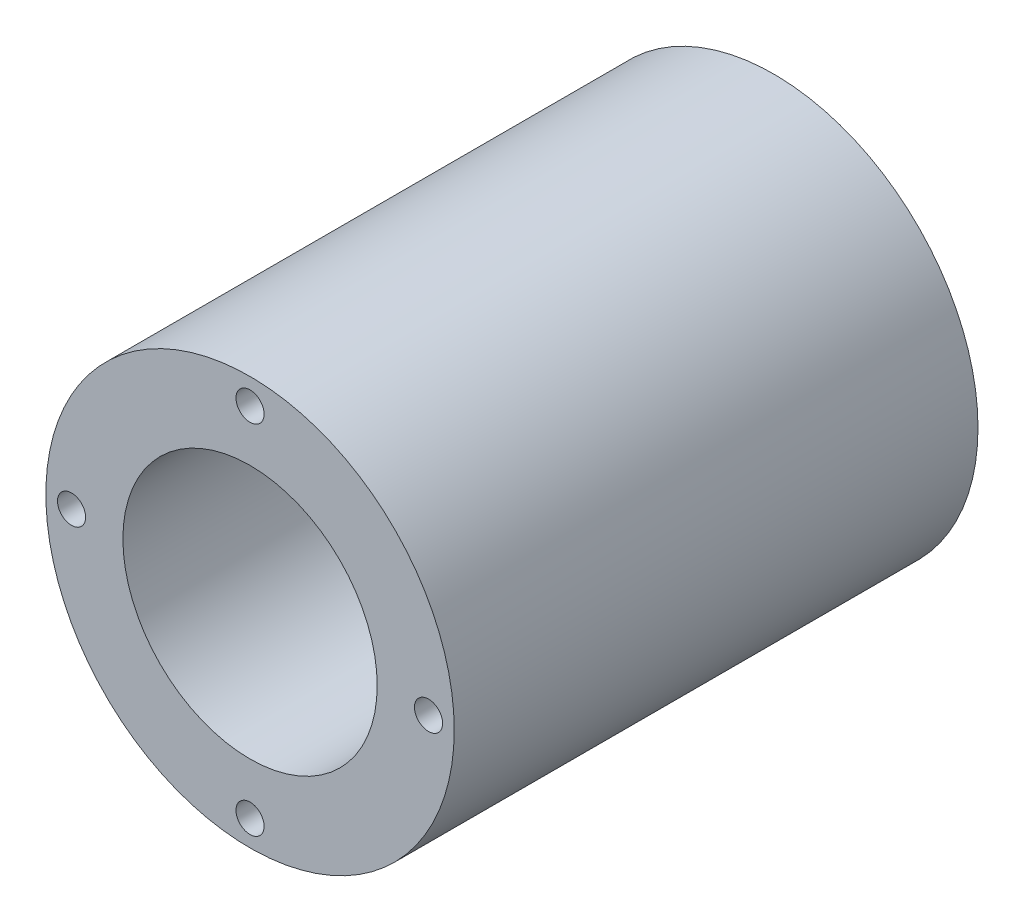
ISO-10303-21;
HEADER;
FILE_DESCRIPTION(('STEP AP214'),'2;1');
FILE_NAME('part.step','',(''),(''),'','','');
FILE_SCHEMA(('AUTOMOTIVE_DESIGN { 1 0 10303 214 1 1 1 1 }'));
ENDSEC;
DATA;
#1=APPLICATION_CONTEXT('core data for automotive mechanical design processes');
#2=APPLICATION_PROTOCOL_DEFINITION('international standard','automotive_design',2000,#1);
#3=PRODUCT_CONTEXT('',#1,'mechanical');
#4=PRODUCT('Part','Part','',(#3));
#5=PRODUCT_RELATED_PRODUCT_CATEGORY('part','',(#4));
#6=PRODUCT_DEFINITION_FORMATION('','',#4);
#7=PRODUCT_DEFINITION_CONTEXT('part definition',#1,'design');
#8=PRODUCT_DEFINITION('design','',#6,#7);
#9=PRODUCT_DEFINITION_SHAPE('','',#8);
#10=(LENGTH_UNIT() NAMED_UNIT(*) SI_UNIT(.MILLI.,.METRE.));
#11=(NAMED_UNIT(*) PLANE_ANGLE_UNIT() SI_UNIT($,.RADIAN.));
#12=(NAMED_UNIT(*) SI_UNIT($,.STERADIAN.) SOLID_ANGLE_UNIT());
#13=UNCERTAINTY_MEASURE_WITH_UNIT(LENGTH_MEASURE(1.E-05),#10,'distance_accuracy_value','');
#14=(GEOMETRIC_REPRESENTATION_CONTEXT(3) GLOBAL_UNCERTAINTY_ASSIGNED_CONTEXT((#13)) GLOBAL_UNIT_ASSIGNED_CONTEXT((#10,
#11,#12)) REPRESENTATION_CONTEXT('',''));
#15=CARTESIAN_POINT('',(0.,0.,0.));
#16=DIRECTION('',(0.,0.,1.));
#17=DIRECTION('',(1.,0.,0.));
#18=AXIS2_PLACEMENT_3D('',#15,#16,#17);
#19=CARTESIAN_POINT('',(0.,0.,26.304999936));
#20=DIRECTION('',(0.,0.,-1.));
#21=DIRECTION('',(-1.,0.,0.));
#22=AXIS2_PLACEMENT_3D('',#19,#20,#21);
#23=PLANE('',#22);
#24=CARTESIAN_POINT('',(0.,0.,26.304999936));
#25=DIRECTION('',(0.,0.,1.));
#26=DIRECTION('',(1.,0.,0.));
#27=AXIS2_PLACEMENT_3D('',#24,#25,#26);
#28=CIRCLE('',#27,22.6187);
#29=CARTESIAN_POINT('',(22.6187,0.,26.304999936));
#30=VERTEX_POINT('',#29);
#31=EDGE_CURVE('E54',#30,#30,#28,.T.);
#32=ORIENTED_EDGE('',*,*,#31,.T.);
#33=EDGE_LOOP('',(#32));
#34=FACE_BOUND('',#33,.T.);
#35=CARTESIAN_POINT('',(0.,0.,26.304999936));
#36=DIRECTION('',(0.,0.,-1.));
#37=DIRECTION('',(0.,1.,0.));
#38=AXIS2_PLACEMENT_3D('',#35,#36,#37);
#39=CIRCLE('',#38,24.60625);
#40=CARTESIAN_POINT('',(0.,24.60625,26.304999936));
#41=VERTEX_POINT('',#40);
#42=EDGE_CURVE('E521',#41,#41,#39,.T.);
#43=ORIENTED_EDGE('',*,*,#42,.T.);
#44=EDGE_LOOP('',(#43));
#45=FACE_BOUND('',#44,.T.);
#46=ADVANCED_FACE('F45',(#34,#45),#23,.T.);
#47=CARTESIAN_POINT('',(0.,0.,119.469000076));
#48=DIRECTION('',(0.,0.,-1.));
#49=DIRECTION('',(-1.,0.,0.));
#50=AXIS2_PLACEMENT_3D('',#47,#48,#49);
#51=PLANE('',#50);
#52=CARTESIAN_POINT('',(-31.75,3.32563597524808E-13,119.469000076));
#53=DIRECTION('',(0.,0.,1.));
#54=DIRECTION('',(1.,0.,0.));
#55=AXIS2_PLACEMENT_3D('',#52,#53,#54);
#56=CIRCLE('',#55,2.5);
#57=CARTESIAN_POINT('',(-29.25,3.32563597524808E-13,119.469000076));
#58=VERTEX_POINT('',#57);
#59=EDGE_CURVE('E99',#58,#58,#56,.T.);
#60=ORIENTED_EDGE('',*,*,#59,.F.);
#61=EDGE_LOOP('',(#60));
#62=FACE_BOUND('',#61,.T.);
#63=CARTESIAN_POINT('',(0.,-31.75,119.469000076));
#64=DIRECTION('',(0.,0.,1.));
#65=DIRECTION('',(1.,0.,0.));
#66=AXIS2_PLACEMENT_3D('',#63,#64,#65);
#67=CIRCLE('',#66,2.5);
#68=CARTESIAN_POINT('',(2.5,-31.75,119.469000076));
#69=VERTEX_POINT('',#68);
#70=EDGE_CURVE('E98',#69,#69,#67,.T.);
#71=ORIENTED_EDGE('',*,*,#70,.F.);
#72=EDGE_LOOP('',(#71));
#73=FACE_BOUND('',#72,.T.);
#74=CARTESIAN_POINT('',(31.75,-1.10854532508269E-13,119.469000076));
#75=DIRECTION('',(0.,0.,1.));
#76=DIRECTION('',(1.,0.,0.));
#77=AXIS2_PLACEMENT_3D('',#74,#75,#76);
#78=CIRCLE('',#77,2.5);
#79=CARTESIAN_POINT('',(34.25,-1.10854532508269E-13,119.469000076));
#80=VERTEX_POINT('',#79);
#81=EDGE_CURVE('E114',#80,#80,#78,.T.);
#82=ORIENTED_EDGE('',*,*,#81,.F.);
#83=EDGE_LOOP('',(#82));
#84=FACE_BOUND('',#83,.T.);
#85=CARTESIAN_POINT('',(0.,31.75,119.469000076));
#86=DIRECTION('',(0.,0.,1.));
#87=DIRECTION('',(1.,0.,0.));
#88=AXIS2_PLACEMENT_3D('',#85,#86,#87);
#89=CIRCLE('',#88,2.5);
#90=CARTESIAN_POINT('',(2.5,31.75,119.469000076));
#91=VERTEX_POINT('',#90);
#92=EDGE_CURVE('E122',#91,#91,#89,.T.);
#93=ORIENTED_EDGE('',*,*,#92,.F.);
#94=EDGE_LOOP('',(#93));
#95=FACE_BOUND('',#94,.T.);
#96=CARTESIAN_POINT('',(0.,0.,119.469000076));
#97=DIRECTION('',(0.,0.,1.));
#98=DIRECTION('',(1.,0.,0.));
#99=AXIS2_PLACEMENT_3D('',#96,#97,#98);
#100=CIRCLE('',#99,22.6187);
#101=CARTESIAN_POINT('',(22.6187,0.,119.469000076));
#102=VERTEX_POINT('',#101);
#103=EDGE_CURVE('E11',#102,#102,#100,.T.);
#104=ORIENTED_EDGE('',*,*,#103,.F.);
#105=EDGE_LOOP('',(#104));
#106=FACE_BOUND('',#105,.T.);
#107=CARTESIAN_POINT('',(0.,0.,119.469000076));
#108=DIRECTION('',(0.,0.,1.));
#109=DIRECTION('',(1.,0.,0.));
#110=AXIS2_PLACEMENT_3D('',#107,#108,#109);
#111=CIRCLE('',#110,36.322);
#112=CARTESIAN_POINT('',(36.322,0.,119.469000076));
#113=VERTEX_POINT('',#112);
#114=EDGE_CURVE('E178',#113,#113,#111,.T.);
#115=ORIENTED_EDGE('',*,*,#114,.T.);
#116=EDGE_LOOP('',(#115));
#117=FACE_BOUND('',#116,.T.);
#118=ADVANCED_FACE('F47',(#62,#73,#84,#95,#106,#117),#51,.F.);
#119=CARTESIAN_POINT('',(0.,0.,119.469000076));
#120=DIRECTION('',(0.,0.,1.));
#121=DIRECTION('',(1.,0.,0.));
#122=AXIS2_PLACEMENT_3D('',#119,#120,#121);
#123=CYLINDRICAL_SURFACE('',#122,22.6187);
#124=ORIENTED_EDGE('',*,*,#31,.F.);
#125=EDGE_LOOP('',(#124));
#126=FACE_BOUND('',#125,.T.);
#127=ORIENTED_EDGE('',*,*,#103,.T.);
#128=EDGE_LOOP('',(#127));
#129=FACE_BOUND('',#128,.T.);
#130=ADVANCED_FACE('F191',(#126,#129),#123,.F.);
#131=CARTESIAN_POINT('',(0.,0.,26.304999936));
#132=DIRECTION('',(0.,0.,-1.));
#133=DIRECTION('',(0.,1.,0.));
#134=AXIS2_PLACEMENT_3D('',#131,#132,#133);
#135=CIRCLE('',#134,26.9875);
#136=CARTESIAN_POINT('',(0.,26.9875,26.304999936));
#137=VERTEX_POINT('',#136);
#138=EDGE_CURVE('E525',#137,#137,#135,.T.);
#139=ORIENTED_EDGE('',*,*,#138,.F.);
#140=EDGE_LOOP('',(#139));
#141=FACE_BOUND('',#140,.T.);
#142=CARTESIAN_POINT('',(-26.3880971899158,15.2351750160003,26.304999936));
#143=DIRECTION('',(0.,0.,-1.));
#144=DIRECTION('',(-1.,0.,0.));
#145=AXIS2_PLACEMENT_3D('',#142,#143,#144);
#146=CIRCLE('',#145,2.49999999999999);
#147=CARTESIAN_POINT('',(-28.8880971899158,15.2351750160003,26.304999936));
#148=VERTEX_POINT('',#147);
#149=EDGE_CURVE('E130',#148,#148,#146,.T.);
#150=ORIENTED_EDGE('',*,*,#149,.F.);
#151=EDGE_LOOP('',(#150));
#152=FACE_BOUND('',#151,.T.);
#153=CARTESIAN_POINT('',(-26.3880971899161,-15.2351750159998,26.304999936));
#154=DIRECTION('',(0.,0.,-1.));
#155=DIRECTION('',(-1.,0.,0.));
#156=AXIS2_PLACEMENT_3D('',#153,#154,#155);
#157=CIRCLE('',#156,2.49999999999999);
#158=CARTESIAN_POINT('',(-28.8880971899161,-15.2351750159998,26.304999936));
#159=VERTEX_POINT('',#158);
#160=EDGE_CURVE('E138',#159,#159,#157,.T.);
#161=ORIENTED_EDGE('',*,*,#160,.F.);
#162=EDGE_LOOP('',(#161));
#163=FACE_BOUND('',#162,.T.);
#164=CARTESIAN_POINT('',(0.,-30.470350032,26.304999936));
#165=DIRECTION('',(0.,0.,-1.));
#166=DIRECTION('',(-1.,0.,0.));
#167=AXIS2_PLACEMENT_3D('',#164,#165,#166);
#168=CIRCLE('',#167,2.49999999999999);
#169=CARTESIAN_POINT('',(-2.49999999999999,-30.470350032,26.304999936));
#170=VERTEX_POINT('',#169);
#171=EDGE_CURVE('E146',#170,#170,#168,.T.);
#172=ORIENTED_EDGE('',*,*,#171,.F.);
#173=EDGE_LOOP('',(#172));
#174=FACE_BOUND('',#173,.T.);
#175=CARTESIAN_POINT('',(26.3880971899159,-15.2351750160001,26.304999936));
#176=DIRECTION('',(0.,0.,-1.));
#177=DIRECTION('',(-1.,0.,0.));
#178=AXIS2_PLACEMENT_3D('',#175,#176,#177);
#179=CIRCLE('',#178,2.49999999999999);
#180=CARTESIAN_POINT('',(23.8880971899159,-15.2351750160001,26.304999936));
#181=VERTEX_POINT('',#180);
#182=EDGE_CURVE('E154',#181,#181,#179,.T.);
#183=ORIENTED_EDGE('',*,*,#182,.F.);
#184=EDGE_LOOP('',(#183));
#185=FACE_BOUND('',#184,.T.);
#186=CARTESIAN_POINT('',(26.388097189916,15.2351750159999,26.304999936));
#187=DIRECTION('',(0.,0.,-1.));
#188=DIRECTION('',(-1.,0.,0.));
#189=AXIS2_PLACEMENT_3D('',#186,#187,#188);
#190=CIRCLE('',#189,2.49999999999999);
#191=CARTESIAN_POINT('',(23.888097189916,15.2351750159999,26.304999936));
#192=VERTEX_POINT('',#191);
#193=EDGE_CURVE('E162',#192,#192,#190,.T.);
#194=ORIENTED_EDGE('',*,*,#193,.F.);
#195=EDGE_LOOP('',(#194));
#196=FACE_BOUND('',#195,.T.);
#197=CARTESIAN_POINT('',(0.,30.470350032,26.304999936));
#198=DIRECTION('',(0.,0.,-1.));
#199=DIRECTION('',(-1.,0.,0.));
#200=AXIS2_PLACEMENT_3D('',#197,#198,#199);
#201=CIRCLE('',#200,2.49999999999999);
#202=CARTESIAN_POINT('',(-2.49999999999999,30.470350032,26.304999936));
#203=VERTEX_POINT('',#202);
#204=EDGE_CURVE('E170',#203,#203,#201,.T.);
#205=ORIENTED_EDGE('',*,*,#204,.F.);
#206=EDGE_LOOP('',(#205));
#207=FACE_BOUND('',#206,.T.);
#208=CARTESIAN_POINT('',(0.,0.,26.304999936));
#209=DIRECTION('',(0.,0.,1.));
#210=DIRECTION('',(1.,0.,0.));
#211=AXIS2_PLACEMENT_3D('',#208,#209,#210);
#212=CIRCLE('',#211,36.322);
#213=CARTESIAN_POINT('',(36.322,0.,26.304999936));
#214=VERTEX_POINT('',#213);
#215=EDGE_CURVE('E182',#214,#214,#212,.T.);
#216=ORIENTED_EDGE('',*,*,#215,.F.);
#217=EDGE_LOOP('',(#216));
#218=FACE_BOUND('',#217,.T.);
#219=ADVANCED_FACE('F194',(#141,#152,#163,#174,#185,#196,#207,#218),#23,.T.);
#220=CARTESIAN_POINT('',(0.,0.,119.469000076));
#221=DIRECTION('',(0.,0.,1.));
#222=DIRECTION('',(1.,0.,0.));
#223=AXIS2_PLACEMENT_3D('',#220,#221,#222);
#224=CYLINDRICAL_SURFACE('',#223,36.322);
#225=ORIENTED_EDGE('',*,*,#215,.T.);
#226=EDGE_LOOP('',(#225));
#227=FACE_BOUND('',#226,.T.);
#228=ORIENTED_EDGE('',*,*,#114,.F.);
#229=EDGE_LOOP('',(#228));
#230=FACE_BOUND('',#229,.T.);
#231=ADVANCED_FACE('F202',(#227,#230),#224,.T.);
#232=CARTESIAN_POINT('',(0.,30.470350032,41.290999936));
#233=DIRECTION('',(0.,0.,-1.));
#234=DIRECTION('',(-1.,0.,0.));
#235=AXIS2_PLACEMENT_3D('',#232,#233,#234);
#236=CONICAL_SURFACE('',#235,2.5,1.02974425867665);
#237=CARTESIAN_POINT('',(0.,30.470350032,42.7931514835689));
#238=VERTEX_POINT('',#237);
#239=VERTEX_LOOP('',#238);
#240=FACE_BOUND('',#239,.T.);
#241=CARTESIAN_POINT('',(0.,30.470350032,41.290999936));
#242=DIRECTION('',(0.,0.,-1.));
#243=DIRECTION('',(-1.,0.,0.));
#244=AXIS2_PLACEMENT_3D('',#241,#242,#243);
#245=CIRCLE('',#244,2.5);
#246=CARTESIAN_POINT('',(-2.5,30.470350032,41.290999936));
#247=VERTEX_POINT('',#246);
#248=EDGE_CURVE('E174',#247,#247,#245,.T.);
#249=ORIENTED_EDGE('',*,*,#248,.T.);
#250=EDGE_LOOP('',(#249));
#251=FACE_BOUND('',#250,.T.);
#252=ADVANCED_FACE('F204',(#240,#251),#236,.F.);
#253=CARTESIAN_POINT('',(0.,30.470350032,26.304999936));
#254=DIRECTION('',(0.,0.,-1.));
#255=DIRECTION('',(-1.,0.,0.));
#256=AXIS2_PLACEMENT_3D('',#253,#254,#255);
#257=CYLINDRICAL_SURFACE('',#256,2.49999999999999);
#258=ORIENTED_EDGE('',*,*,#248,.F.);
#259=EDGE_LOOP('',(#258));
#260=FACE_BOUND('',#259,.T.);
#261=ORIENTED_EDGE('',*,*,#204,.T.);
#262=EDGE_LOOP('',(#261));
#263=FACE_BOUND('',#262,.T.);
#264=ADVANCED_FACE('F211',(#260,#263),#257,.F.);
#265=CARTESIAN_POINT('',(26.388097189916,15.2351750159999,41.290999936));
#266=DIRECTION('',(0.,0.,-1.));
#267=DIRECTION('',(-1.,0.,0.));
#268=AXIS2_PLACEMENT_3D('',#265,#266,#267);
#269=CONICAL_SURFACE('',#268,2.5,1.02974425867665);
#270=CARTESIAN_POINT('',(26.388097189916,15.2351750159999,42.7931514835689));
#271=VERTEX_POINT('',#270);
#272=VERTEX_LOOP('',#271);
#273=FACE_BOUND('',#272,.T.);
#274=CARTESIAN_POINT('',(26.388097189916,15.2351750159999,41.290999936));
#275=DIRECTION('',(0.,0.,-1.));
#276=DIRECTION('',(-1.,0.,0.));
#277=AXIS2_PLACEMENT_3D('',#274,#275,#276);
#278=CIRCLE('',#277,2.5);
#279=CARTESIAN_POINT('',(23.888097189916,15.2351750159999,41.290999936));
#280=VERTEX_POINT('',#279);
#281=EDGE_CURVE('E166',#280,#280,#278,.T.);
#282=ORIENTED_EDGE('',*,*,#281,.T.);
#283=EDGE_LOOP('',(#282));
#284=FACE_BOUND('',#283,.T.);
#285=ADVANCED_FACE('F330',(#273,#284),#269,.F.);
#286=CARTESIAN_POINT('',(26.388097189916,15.2351750159999,26.304999936));
#287=DIRECTION('',(0.,0.,-1.));
#288=DIRECTION('',(-1.,0.,0.));
#289=AXIS2_PLACEMENT_3D('',#286,#287,#288);
#290=CYLINDRICAL_SURFACE('',#289,2.49999999999999);
#291=ORIENTED_EDGE('',*,*,#281,.F.);
#292=EDGE_LOOP('',(#291));
#293=FACE_BOUND('',#292,.T.);
#294=ORIENTED_EDGE('',*,*,#193,.T.);
#295=EDGE_LOOP('',(#294));
#296=FACE_BOUND('',#295,.T.);
#297=ADVANCED_FACE('F326',(#293,#296),#290,.F.);
#298=CARTESIAN_POINT('',(26.3880971899159,-15.2351750160001,41.290999936));
#299=DIRECTION('',(0.,0.,-1.));
#300=DIRECTION('',(-1.,0.,0.));
#301=AXIS2_PLACEMENT_3D('',#298,#299,#300);
#302=CONICAL_SURFACE('',#301,2.5,1.02974425867665);
#303=CARTESIAN_POINT('',(26.3880971899159,-15.2351750160001,42.7931514835689));
#304=VERTEX_POINT('',#303);
#305=VERTEX_LOOP('',#304);
#306=FACE_BOUND('',#305,.T.);
#307=CARTESIAN_POINT('',(26.3880971899159,-15.2351750160001,41.290999936));
#308=DIRECTION('',(0.,0.,-1.));
#309=DIRECTION('',(-1.,0.,0.));
#310=AXIS2_PLACEMENT_3D('',#307,#308,#309);
#311=CIRCLE('',#310,2.5);
#312=CARTESIAN_POINT('',(23.8880971899159,-15.2351750160001,41.290999936));
#313=VERTEX_POINT('',#312);
#314=EDGE_CURVE('E158',#313,#313,#311,.T.);
#315=ORIENTED_EDGE('',*,*,#314,.T.);
#316=EDGE_LOOP('',(#315));
#317=FACE_BOUND('',#316,.T.);
#318=ADVANCED_FACE('F322',(#306,#317),#302,.F.);
#319=CARTESIAN_POINT('',(26.3880971899159,-15.2351750160001,26.304999936));
#320=DIRECTION('',(0.,0.,-1.));
#321=DIRECTION('',(-1.,0.,0.));
#322=AXIS2_PLACEMENT_3D('',#319,#320,#321);
#323=CYLINDRICAL_SURFACE('',#322,2.49999999999999);
#324=ORIENTED_EDGE('',*,*,#314,.F.);
#325=EDGE_LOOP('',(#324));
#326=FACE_BOUND('',#325,.T.);
#327=ORIENTED_EDGE('',*,*,#182,.T.);
#328=EDGE_LOOP('',(#327));
#329=FACE_BOUND('',#328,.T.);
#330=ADVANCED_FACE('F318',(#326,#329),#323,.F.);
#331=CARTESIAN_POINT('',(0.,-30.470350032,41.290999936));
#332=DIRECTION('',(0.,0.,-1.));
#333=DIRECTION('',(-1.,0.,0.));
#334=AXIS2_PLACEMENT_3D('',#331,#332,#333);
#335=CONICAL_SURFACE('',#334,2.5,1.02974425867665);
#336=CARTESIAN_POINT('',(0.,-30.470350032,42.7931514835689));
#337=VERTEX_POINT('',#336);
#338=VERTEX_LOOP('',#337);
#339=FACE_BOUND('',#338,.T.);
#340=CARTESIAN_POINT('',(0.,-30.470350032,41.290999936));
#341=DIRECTION('',(0.,0.,-1.));
#342=DIRECTION('',(-1.,0.,0.));
#343=AXIS2_PLACEMENT_3D('',#340,#341,#342);
#344=CIRCLE('',#343,2.5);
#345=CARTESIAN_POINT('',(-2.5,-30.470350032,41.290999936));
#346=VERTEX_POINT('',#345);
#347=EDGE_CURVE('E150',#346,#346,#344,.T.);
#348=ORIENTED_EDGE('',*,*,#347,.T.);
#349=EDGE_LOOP('',(#348));
#350=FACE_BOUND('',#349,.T.);
#351=ADVANCED_FACE('F314',(#339,#350),#335,.F.);
#352=CARTESIAN_POINT('',(0.,-30.470350032,26.304999936));
#353=DIRECTION('',(0.,0.,-1.));
#354=DIRECTION('',(-1.,0.,0.));
#355=AXIS2_PLACEMENT_3D('',#352,#353,#354);
#356=CYLINDRICAL_SURFACE('',#355,2.49999999999999);
#357=ORIENTED_EDGE('',*,*,#347,.F.);
#358=EDGE_LOOP('',(#357));
#359=FACE_BOUND('',#358,.T.);
#360=ORIENTED_EDGE('',*,*,#171,.T.);
#361=EDGE_LOOP('',(#360));
#362=FACE_BOUND('',#361,.T.);
#363=ADVANCED_FACE('F310',(#359,#362),#356,.F.);
#364=CARTESIAN_POINT('',(-26.3880971899161,-15.2351750159998,41.290999936));
#365=DIRECTION('',(0.,0.,-1.));
#366=DIRECTION('',(-1.,0.,0.));
#367=AXIS2_PLACEMENT_3D('',#364,#365,#366);
#368=CONICAL_SURFACE('',#367,2.5,1.02974425867665);
#369=CARTESIAN_POINT('',(-26.3880971899161,-15.2351750159998,42.7931514835689));
#370=VERTEX_POINT('',#369);
#371=VERTEX_LOOP('',#370);
#372=FACE_BOUND('',#371,.T.);
#373=CARTESIAN_POINT('',(-26.3880971899161,-15.2351750159998,41.290999936));
#374=DIRECTION('',(0.,0.,-1.));
#375=DIRECTION('',(-1.,0.,0.));
#376=AXIS2_PLACEMENT_3D('',#373,#374,#375);
#377=CIRCLE('',#376,2.5);
#378=CARTESIAN_POINT('',(-28.8880971899161,-15.2351750159998,41.290999936));
#379=VERTEX_POINT('',#378);
#380=EDGE_CURVE('E142',#379,#379,#377,.T.);
#381=ORIENTED_EDGE('',*,*,#380,.T.);
#382=EDGE_LOOP('',(#381));
#383=FACE_BOUND('',#382,.T.);
#384=ADVANCED_FACE('F306',(#372,#383),#368,.F.);
#385=CARTESIAN_POINT('',(-26.3880971899161,-15.2351750159998,26.304999936));
#386=DIRECTION('',(0.,0.,-1.));
#387=DIRECTION('',(-1.,0.,0.));
#388=AXIS2_PLACEMENT_3D('',#385,#386,#387);
#389=CYLINDRICAL_SURFACE('',#388,2.49999999999999);
#390=ORIENTED_EDGE('',*,*,#380,.F.);
#391=EDGE_LOOP('',(#390));
#392=FACE_BOUND('',#391,.T.);
#393=ORIENTED_EDGE('',*,*,#160,.T.);
#394=EDGE_LOOP('',(#393));
#395=FACE_BOUND('',#394,.T.);
#396=ADVANCED_FACE('F302',(#392,#395),#389,.F.);
#397=CARTESIAN_POINT('',(-26.3880971899158,15.2351750160003,41.290999936));
#398=DIRECTION('',(0.,0.,-1.));
#399=DIRECTION('',(-1.,0.,0.));
#400=AXIS2_PLACEMENT_3D('',#397,#398,#399);
#401=CONICAL_SURFACE('',#400,2.5,1.02974425867665);
#402=CARTESIAN_POINT('',(-26.3880971899158,15.2351750160003,42.7931514835689));
#403=VERTEX_POINT('',#402);
#404=VERTEX_LOOP('',#403);
#405=FACE_BOUND('',#404,.T.);
#406=CARTESIAN_POINT('',(-26.3880971899158,15.2351750160003,41.290999936));
#407=DIRECTION('',(0.,0.,-1.));
#408=DIRECTION('',(-1.,0.,0.));
#409=AXIS2_PLACEMENT_3D('',#406,#407,#408);
#410=CIRCLE('',#409,2.5);
#411=CARTESIAN_POINT('',(-28.8880971899158,15.2351750160003,41.290999936));
#412=VERTEX_POINT('',#411);
#413=EDGE_CURVE('E134',#412,#412,#410,.T.);
#414=ORIENTED_EDGE('',*,*,#413,.T.);
#415=EDGE_LOOP('',(#414));
#416=FACE_BOUND('',#415,.T.);
#417=ADVANCED_FACE('F298',(#405,#416),#401,.F.);
#418=CARTESIAN_POINT('',(-26.3880971899158,15.2351750160003,26.304999936));
#419=DIRECTION('',(0.,0.,-1.));
#420=DIRECTION('',(-1.,0.,0.));
#421=AXIS2_PLACEMENT_3D('',#418,#419,#420);
#422=CYLINDRICAL_SURFACE('',#421,2.49999999999999);
#423=ORIENTED_EDGE('',*,*,#413,.F.);
#424=EDGE_LOOP('',(#423));
#425=FACE_BOUND('',#424,.T.);
#426=ORIENTED_EDGE('',*,*,#149,.T.);
#427=EDGE_LOOP('',(#426));
#428=FACE_BOUND('',#427,.T.);
#429=ADVANCED_FACE('F294',(#425,#428),#422,.F.);
#430=CARTESIAN_POINT('',(0.,31.75,104.469000076));
#431=DIRECTION('',(0.,0.,1.));
#432=DIRECTION('',(1.,0.,0.));
#433=AXIS2_PLACEMENT_3D('',#430,#431,#432);
#434=CONICAL_SURFACE('',#433,2.5,1.02974425867665);
#435=CARTESIAN_POINT('',(0.,31.75,102.966848528431));
#436=VERTEX_POINT('',#435);
#437=VERTEX_LOOP('',#436);
#438=FACE_BOUND('',#437,.T.);
#439=CARTESIAN_POINT('',(0.,31.75,104.469000076));
#440=DIRECTION('',(0.,0.,1.));
#441=DIRECTION('',(1.,0.,0.));
#442=AXIS2_PLACEMENT_3D('',#439,#440,#441);
#443=CIRCLE('',#442,2.5);
#444=CARTESIAN_POINT('',(2.5,31.75,104.469000076));
#445=VERTEX_POINT('',#444);
#446=EDGE_CURVE('E126',#445,#445,#443,.T.);
#447=ORIENTED_EDGE('',*,*,#446,.T.);
#448=EDGE_LOOP('',(#447));
#449=FACE_BOUND('',#448,.T.);
#450=ADVANCED_FACE('F290',(#438,#449),#434,.F.);
#451=CARTESIAN_POINT('',(0.,31.75,119.469000076));
#452=DIRECTION('',(0.,0.,1.));
#453=DIRECTION('',(1.,0.,0.));
#454=AXIS2_PLACEMENT_3D('',#451,#452,#453);
#455=CYLINDRICAL_SURFACE('',#454,2.5);
#456=ORIENTED_EDGE('',*,*,#446,.F.);
#457=EDGE_LOOP('',(#456));
#458=FACE_BOUND('',#457,.T.);
#459=ORIENTED_EDGE('',*,*,#92,.T.);
#460=EDGE_LOOP('',(#459));
#461=FACE_BOUND('',#460,.T.);
#462=ADVANCED_FACE('F286',(#458,#461),#455,.F.);
#463=CARTESIAN_POINT('',(31.75,-1.10854532508269E-13,104.469000076));
#464=DIRECTION('',(0.,0.,1.));
#465=DIRECTION('',(1.,0.,0.));
#466=AXIS2_PLACEMENT_3D('',#463,#464,#465);
#467=CONICAL_SURFACE('',#466,2.5,1.02974425867665);
#468=CARTESIAN_POINT('',(31.75,-1.10854532508269E-13,102.966848528431));
#469=VERTEX_POINT('',#468);
#470=VERTEX_LOOP('',#469);
#471=FACE_BOUND('',#470,.T.);
#472=CARTESIAN_POINT('',(31.75,-1.10854532508269E-13,104.469000076));
#473=DIRECTION('',(0.,0.,1.));
#474=DIRECTION('',(1.,0.,0.));
#475=AXIS2_PLACEMENT_3D('',#472,#473,#474);
#476=CIRCLE('',#475,2.5);
#477=CARTESIAN_POINT('',(34.25,-1.10854532508269E-13,104.469000076));
#478=VERTEX_POINT('',#477);
#479=EDGE_CURVE('E118',#478,#478,#476,.T.);
#480=ORIENTED_EDGE('',*,*,#479,.T.);
#481=EDGE_LOOP('',(#480));
#482=FACE_BOUND('',#481,.T.);
#483=ADVANCED_FACE('F282',(#471,#482),#467,.F.);
#484=CARTESIAN_POINT('',(31.75,-1.10854532508269E-13,119.469000076));
#485=DIRECTION('',(0.,0.,1.));
#486=DIRECTION('',(1.,0.,0.));
#487=AXIS2_PLACEMENT_3D('',#484,#485,#486);
#488=CYLINDRICAL_SURFACE('',#487,2.5);
#489=ORIENTED_EDGE('',*,*,#479,.F.);
#490=EDGE_LOOP('',(#489));
#491=FACE_BOUND('',#490,.T.);
#492=ORIENTED_EDGE('',*,*,#81,.T.);
#493=EDGE_LOOP('',(#492));
#494=FACE_BOUND('',#493,.T.);
#495=ADVANCED_FACE('F278',(#491,#494),#488,.F.);
#496=CARTESIAN_POINT('',(0.,-31.75,104.469000076));
#497=DIRECTION('',(0.,0.,1.));
#498=DIRECTION('',(1.,0.,0.));
#499=AXIS2_PLACEMENT_3D('',#496,#497,#498);
#500=CONICAL_SURFACE('',#499,2.5,1.02974425867665);
#501=CARTESIAN_POINT('',(0.,-31.75,102.966848528431));
#502=VERTEX_POINT('',#501);
#503=VERTEX_LOOP('',#502);
#504=FACE_BOUND('',#503,.T.);
#505=CARTESIAN_POINT('',(0.,-31.75,104.469000076));
#506=DIRECTION('',(0.,0.,1.));
#507=DIRECTION('',(1.,0.,0.));
#508=AXIS2_PLACEMENT_3D('',#505,#506,#507);
#509=CIRCLE('',#508,2.5);
#510=CARTESIAN_POINT('',(2.5,-31.75,104.469000076));
#511=VERTEX_POINT('',#510);
#512=EDGE_CURVE('E104',#511,#511,#509,.T.);
#513=ORIENTED_EDGE('',*,*,#512,.T.);
#514=EDGE_LOOP('',(#513));
#515=FACE_BOUND('',#514,.T.);
#516=ADVANCED_FACE('F274',(#504,#515),#500,.F.);
#517=CARTESIAN_POINT('',(0.,-31.75,119.469000076));
#518=DIRECTION('',(0.,0.,1.));
#519=DIRECTION('',(1.,0.,0.));
#520=AXIS2_PLACEMENT_3D('',#517,#518,#519);
#521=CYLINDRICAL_SURFACE('',#520,2.5);
#522=ORIENTED_EDGE('',*,*,#512,.F.);
#523=EDGE_LOOP('',(#522));
#524=FACE_BOUND('',#523,.T.);
#525=ORIENTED_EDGE('',*,*,#70,.T.);
#526=EDGE_LOOP('',(#525));
#527=FACE_BOUND('',#526,.T.);
#528=ADVANCED_FACE('F91',(#524,#527),#521,.F.);
#529=CARTESIAN_POINT('',(-31.75,3.32563597524808E-13,104.469000076));
#530=DIRECTION('',(0.,0.,1.));
#531=DIRECTION('',(1.,0.,0.));
#532=AXIS2_PLACEMENT_3D('',#529,#530,#531);
#533=CONICAL_SURFACE('',#532,2.5,1.02974425867665);
#534=CARTESIAN_POINT('',(-31.75,3.32563597524808E-13,102.966848528431));
#535=VERTEX_POINT('',#534);
#536=VERTEX_LOOP('',#535);
#537=FACE_BOUND('',#536,.T.);
#538=CARTESIAN_POINT('',(-31.75,3.32563597524808E-13,104.469000076));
#539=DIRECTION('',(0.,0.,1.));
#540=DIRECTION('',(1.,0.,0.));
#541=AXIS2_PLACEMENT_3D('',#538,#539,#540);
#542=CIRCLE('',#541,2.5);
#543=CARTESIAN_POINT('',(-29.25,3.32563597524808E-13,104.469000076));
#544=VERTEX_POINT('',#543);
#545=EDGE_CURVE('E95',#544,#544,#542,.T.);
#546=ORIENTED_EDGE('',*,*,#545,.T.);
#547=EDGE_LOOP('',(#546));
#548=FACE_BOUND('',#547,.T.);
#549=ADVANCED_FACE('F87',(#537,#548),#533,.F.);
#550=CARTESIAN_POINT('',(-31.75,3.32563597524808E-13,119.469000076));
#551=DIRECTION('',(0.,0.,1.));
#552=DIRECTION('',(1.,0.,0.));
#553=AXIS2_PLACEMENT_3D('',#550,#551,#552);
#554=CYLINDRICAL_SURFACE('',#553,2.5);
#555=ORIENTED_EDGE('',*,*,#545,.F.);
#556=EDGE_LOOP('',(#555));
#557=FACE_BOUND('',#556,.T.);
#558=ORIENTED_EDGE('',*,*,#59,.T.);
#559=EDGE_LOOP('',(#558));
#560=FACE_BOUND('',#559,.T.);
#561=ADVANCED_FACE('F90',(#557,#560),#554,.F.);
#562=CARTESIAN_POINT('',(0.,0.,26.804999936));
#563=DIRECTION('',(0.,0.,-1.));
#564=DIRECTION('',(0.,1.,0.));
#565=AXIS2_PLACEMENT_3D('',#562,#563,#564);
#566=CYLINDRICAL_SURFACE('',#565,26.9875);
#567=CARTESIAN_POINT('',(0.,0.,26.804999936));
#568=DIRECTION('',(0.,0.,-1.));
#569=DIRECTION('',(0.,1.,0.));
#570=AXIS2_PLACEMENT_3D('',#567,#568,#569);
#571=CIRCLE('',#570,26.9875);
#572=CARTESIAN_POINT('',(0.,26.9875,26.804999936));
#573=VERTEX_POINT('',#572);
#574=EDGE_CURVE('E107',#573,#573,#571,.T.);
#575=ORIENTED_EDGE('',*,*,#574,.F.);
#576=EDGE_LOOP('',(#575));
#577=FACE_BOUND('',#576,.T.);
#578=ORIENTED_EDGE('',*,*,#138,.T.);
#579=EDGE_LOOP('',(#578));
#580=FACE_BOUND('',#579,.T.);
#581=ADVANCED_FACE('F238',(#577,#580),#566,.F.);
#582=CARTESIAN_POINT('',(0.,0.,26.804999936));
#583=DIRECTION('',(0.,0.,-1.));
#584=DIRECTION('',(0.,1.,0.));
#585=AXIS2_PLACEMENT_3D('',#582,#583,#584);
#586=PLANE('',#585);
#587=CARTESIAN_POINT('',(0.,0.,26.804999936));
#588=DIRECTION('',(0.,0.,-1.));
#589=DIRECTION('',(0.,1.,0.));
#590=AXIS2_PLACEMENT_3D('',#587,#588,#589);
#591=CIRCLE('',#590,24.60625);
#592=CARTESIAN_POINT('',(0.,24.60625,26.804999936));
#593=VERTEX_POINT('',#592);
#594=EDGE_CURVE('E518',#593,#593,#591,.T.);
#595=ORIENTED_EDGE('',*,*,#594,.F.);
#596=EDGE_LOOP('',(#595));
#597=FACE_BOUND('',#596,.T.);
#598=ORIENTED_EDGE('',*,*,#574,.T.);
#599=EDGE_LOOP('',(#598));
#600=FACE_BOUND('',#599,.T.);
#601=ADVANCED_FACE('F243',(#597,#600),#586,.T.);
#602=CARTESIAN_POINT('',(0.,0.,26.804999936));
#603=DIRECTION('',(0.,0.,-1.));
#604=DIRECTION('',(0.,1.,0.));
#605=AXIS2_PLACEMENT_3D('',#602,#603,#604);
#606=CYLINDRICAL_SURFACE('',#605,24.60625);
#607=ORIENTED_EDGE('',*,*,#594,.T.);
#608=EDGE_LOOP('',(#607));
#609=FACE_BOUND('',#608,.T.);
#610=ORIENTED_EDGE('',*,*,#42,.F.);
#611=EDGE_LOOP('',(#610));
#612=FACE_BOUND('',#611,.T.);
#613=ADVANCED_FACE('F254',(#609,#612),#606,.T.);
#614=CLOSED_SHELL('',(#46,#118,#130,#219,#231,#252,#264,#285,#297,#318,#330,#351,#363,#384,#396,
#417,#429,#450,#462,#483,#495,#516,#528,#549,#561,#581,#601,#613));
#615=MANIFOLD_SOLID_BREP('B2',#614);
#616=ADVANCED_BREP_SHAPE_REPRESENTATION('',(#18,#615),#14);
#617=SHAPE_DEFINITION_REPRESENTATION(#9,#616);
ENDSEC;
END-ISO-10303-21;
